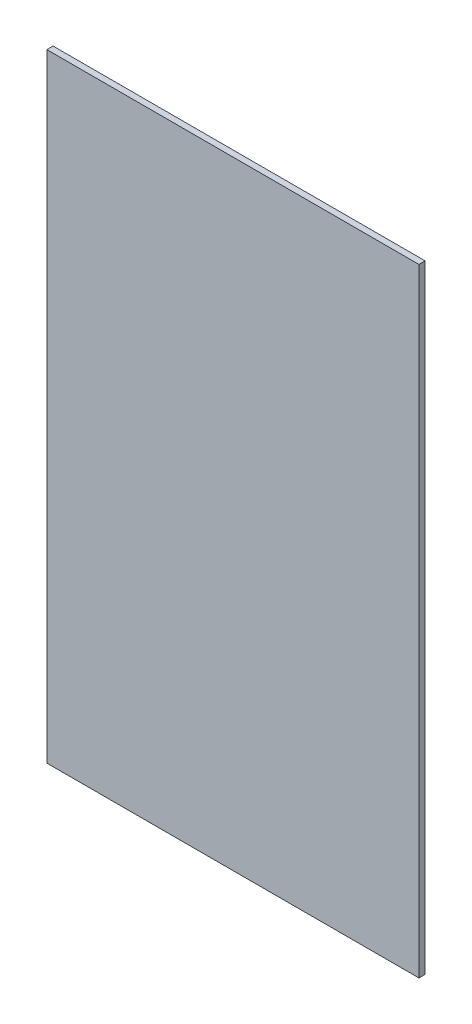
ISO-10303-21;
HEADER;
FILE_DESCRIPTION(('STEP AP214'),'2;1');
FILE_NAME('part.step','',(''),(''),'','','');
FILE_SCHEMA(('AUTOMOTIVE_DESIGN { 1 0 10303 214 1 1 1 1 }'));
ENDSEC;
DATA;
#1=APPLICATION_CONTEXT('core data for automotive mechanical design processes');
#2=APPLICATION_PROTOCOL_DEFINITION('international standard','automotive_design',2000,#1);
#3=PRODUCT_CONTEXT('',#1,'mechanical');
#4=PRODUCT('Part','Part','',(#3));
#5=PRODUCT_RELATED_PRODUCT_CATEGORY('part','',(#4));
#6=PRODUCT_DEFINITION_FORMATION('','',#4);
#7=PRODUCT_DEFINITION_CONTEXT('part definition',#1,'design');
#8=PRODUCT_DEFINITION('design','',#6,#7);
#9=PRODUCT_DEFINITION_SHAPE('','',#8);
#10=(LENGTH_UNIT() NAMED_UNIT(*) SI_UNIT(.MILLI.,.METRE.));
#11=(NAMED_UNIT(*) PLANE_ANGLE_UNIT() SI_UNIT($,.RADIAN.));
#12=(NAMED_UNIT(*) SI_UNIT($,.STERADIAN.) SOLID_ANGLE_UNIT());
#13=UNCERTAINTY_MEASURE_WITH_UNIT(LENGTH_MEASURE(1.E-05),#10,'distance_accuracy_value','');
#14=(GEOMETRIC_REPRESENTATION_CONTEXT(3) GLOBAL_UNCERTAINTY_ASSIGNED_CONTEXT((#13)) GLOBAL_UNIT_ASSIGNED_CONTEXT((#10,
#11,#12)) REPRESENTATION_CONTEXT('',''));
#15=CARTESIAN_POINT('',(0.,0.,0.));
#16=DIRECTION('',(0.,0.,1.));
#17=DIRECTION('',(1.,0.,0.));
#18=AXIS2_PLACEMENT_3D('',#15,#16,#17);
#19=CARTESIAN_POINT('',(-215.135135135135,216.860411045452,8.));
#20=DIRECTION('',(1.,0.,0.));
#21=DIRECTION('',(0.,1.,0.));
#22=AXIS2_PLACEMENT_3D('',#19,#20,#21);
#23=PLANE('',#22);
#24=DIRECTION('',(0.,-1.,0.));
#25=VECTOR('',#24,1.);
#26=CARTESIAN_POINT('',(-215.135135135135,216.860411045452,0.));
#27=LINE('',#26,#25);
#28=CARTESIAN_POINT('',(-215.135135135135,216.860411045452,0.));
#29=VERTEX_POINT('',#28);
#30=CARTESIAN_POINT('',(-215.135135135135,-580.139588954548,0.));
#31=VERTEX_POINT('',#30);
#32=EDGE_CURVE('E106',#29,#31,#27,.T.);
#33=ORIENTED_EDGE('',*,*,#32,.T.);
#34=DIRECTION('',(0.,0.,-1.));
#35=VECTOR('',#34,1.);
#36=CARTESIAN_POINT('',(-215.135135135135,-580.139588954548,8.));
#37=LINE('',#36,#35);
#38=CARTESIAN_POINT('',(-215.135135135135,-580.139588954548,8.));
#39=VERTEX_POINT('',#38);
#40=EDGE_CURVE('E11',#39,#31,#37,.T.);
#41=ORIENTED_EDGE('',*,*,#40,.F.);
#42=DIRECTION('',(0.,-1.,0.));
#43=VECTOR('',#42,1.);
#44=CARTESIAN_POINT('',(-215.135135135135,216.860411045452,8.));
#45=LINE('',#44,#43);
#46=CARTESIAN_POINT('',(-215.135135135135,216.860411045452,8.));
#47=VERTEX_POINT('',#46);
#48=EDGE_CURVE('E94',#47,#39,#45,.T.);
#49=ORIENTED_EDGE('',*,*,#48,.F.);
#50=DIRECTION('',(0.,0.,-1.));
#51=VECTOR('',#50,1.);
#52=CARTESIAN_POINT('',(-215.135135135135,216.860411045452,8.));
#53=LINE('',#52,#51);
#54=EDGE_CURVE('E102',#47,#29,#53,.T.);
#55=ORIENTED_EDGE('',*,*,#54,.T.);
#56=EDGE_LOOP('',(#33,#41,#49,#55));
#57=FACE_BOUND('',#56,.T.);
#58=ADVANCED_FACE('F43',(#57),#23,.F.);
#59=CARTESIAN_POINT('',(-215.135135135135,-580.139588954548,8.));
#60=DIRECTION('',(0.,1.,0.));
#61=DIRECTION('',(0.,0.,1.));
#62=AXIS2_PLACEMENT_3D('',#59,#60,#61);
#63=PLANE('',#62);
#64=DIRECTION('',(1.,0.,0.));
#65=VECTOR('',#64,1.);
#66=CARTESIAN_POINT('',(-215.135135135135,-580.139588954548,0.));
#67=LINE('',#66,#65);
#68=CARTESIAN_POINT('',(264.864864864865,-580.139588954548,0.));
#69=VERTEX_POINT('',#68);
#70=EDGE_CURVE('E98',#31,#69,#67,.T.);
#71=ORIENTED_EDGE('',*,*,#70,.T.);
#72=DIRECTION('',(0.,0.,-1.));
#73=VECTOR('',#72,1.);
#74=CARTESIAN_POINT('',(264.864864864865,-580.139588954548,8.));
#75=LINE('',#74,#73);
#76=CARTESIAN_POINT('',(264.864864864865,-580.139588954548,8.));
#77=VERTEX_POINT('',#76);
#78=EDGE_CURVE('E51',#77,#69,#75,.T.);
#79=ORIENTED_EDGE('',*,*,#78,.F.);
#80=DIRECTION('',(1.,0.,0.));
#81=VECTOR('',#80,1.);
#82=CARTESIAN_POINT('',(-215.135135135135,-580.139588954548,8.));
#83=LINE('',#82,#81);
#84=EDGE_CURVE('E89',#39,#77,#83,.T.);
#85=ORIENTED_EDGE('',*,*,#84,.F.);
#86=ORIENTED_EDGE('',*,*,#40,.T.);
#87=EDGE_LOOP('',(#71,#79,#85,#86));
#88=FACE_BOUND('',#87,.T.);
#89=ADVANCED_FACE('F97',(#88),#63,.F.);
#90=CARTESIAN_POINT('',(264.864864864865,216.860411045452,8.));
#91=DIRECTION('',(-1.,0.,0.));
#92=DIRECTION('',(0.,-1.,0.));
#93=AXIS2_PLACEMENT_3D('',#90,#91,#92);
#94=PLANE('',#93);
#95=DIRECTION('',(0.,1.,0.));
#96=VECTOR('',#95,1.);
#97=CARTESIAN_POINT('',(264.864864864865,216.860411045452,0.));
#98=LINE('',#97,#96);
#99=CARTESIAN_POINT('',(264.864864864865,216.860411045452,0.));
#100=VERTEX_POINT('',#99);
#101=EDGE_CURVE('E76',#69,#100,#98,.T.);
#102=ORIENTED_EDGE('',*,*,#101,.T.);
#103=DIRECTION('',(0.,0.,-1.));
#104=VECTOR('',#103,1.);
#105=CARTESIAN_POINT('',(264.864864864865,216.860411045452,8.));
#106=LINE('',#105,#104);
#107=CARTESIAN_POINT('',(264.864864864865,216.860411045452,8.));
#108=VERTEX_POINT('',#107);
#109=EDGE_CURVE('E99',#108,#100,#106,.T.);
#110=ORIENTED_EDGE('',*,*,#109,.F.);
#111=DIRECTION('',(0.,1.,0.));
#112=VECTOR('',#111,1.);
#113=CARTESIAN_POINT('',(264.864864864865,216.860411045452,8.));
#114=LINE('',#113,#112);
#115=EDGE_CURVE('E92',#77,#108,#114,.T.);
#116=ORIENTED_EDGE('',*,*,#115,.F.);
#117=ORIENTED_EDGE('',*,*,#78,.T.);
#118=EDGE_LOOP('',(#102,#110,#116,#117));
#119=FACE_BOUND('',#118,.T.);
#120=ADVANCED_FACE('F100',(#119),#94,.F.);
#121=CARTESIAN_POINT('',(-215.135135135135,216.860411045452,8.));
#122=DIRECTION('',(0.,-1.,0.));
#123=DIRECTION('',(0.,0.,-1.));
#124=AXIS2_PLACEMENT_3D('',#121,#122,#123);
#125=PLANE('',#124);
#126=DIRECTION('',(-1.,0.,0.));
#127=VECTOR('',#126,1.);
#128=CARTESIAN_POINT('',(-215.135135135135,216.860411045452,0.));
#129=LINE('',#128,#127);
#130=EDGE_CURVE('E82',#100,#29,#129,.T.);
#131=ORIENTED_EDGE('',*,*,#130,.T.);
#132=ORIENTED_EDGE('',*,*,#54,.F.);
#133=DIRECTION('',(-1.,0.,0.));
#134=VECTOR('',#133,1.);
#135=CARTESIAN_POINT('',(-215.135135135135,216.860411045452,8.));
#136=LINE('',#135,#134);
#137=EDGE_CURVE('E59',#108,#47,#136,.T.);
#138=ORIENTED_EDGE('',*,*,#137,.F.);
#139=ORIENTED_EDGE('',*,*,#109,.T.);
#140=EDGE_LOOP('',(#131,#132,#138,#139));
#141=FACE_BOUND('',#140,.T.);
#142=ADVANCED_FACE('F113',(#141),#125,.F.);
#143=CARTESIAN_POINT('',(0.,0.,8.));
#144=DIRECTION('',(0.,0.,1.));
#145=DIRECTION('',(1.,0.,0.));
#146=AXIS2_PLACEMENT_3D('',#143,#144,#145);
#147=PLANE('',#146);
#148=ORIENTED_EDGE('',*,*,#48,.T.);
#149=ORIENTED_EDGE('',*,*,#84,.T.);
#150=ORIENTED_EDGE('',*,*,#115,.T.);
#151=ORIENTED_EDGE('',*,*,#137,.T.);
#152=EDGE_LOOP('',(#148,#149,#150,#151));
#153=FACE_BOUND('',#152,.T.);
#154=ADVANCED_FACE('F90',(#153),#147,.T.);
#155=CARTESIAN_POINT('',(0.,0.,0.));
#156=DIRECTION('',(0.,0.,1.));
#157=DIRECTION('',(1.,0.,0.));
#158=AXIS2_PLACEMENT_3D('',#155,#156,#157);
#159=PLANE('',#158);
#160=ORIENTED_EDGE('',*,*,#32,.F.);
#161=ORIENTED_EDGE('',*,*,#130,.F.);
#162=ORIENTED_EDGE('',*,*,#101,.F.);
#163=ORIENTED_EDGE('',*,*,#70,.F.);
#164=EDGE_LOOP('',(#160,#161,#162,#163));
#165=FACE_BOUND('',#164,.T.);
#166=ADVANCED_FACE('F116',(#165),#159,.F.);
#167=CLOSED_SHELL('',(#58,#89,#120,#142,#154,#166));
#168=MANIFOLD_SOLID_BREP('B2',#167);
#169=ADVANCED_BREP_SHAPE_REPRESENTATION('',(#18,#168),#14);
#170=SHAPE_DEFINITION_REPRESENTATION(#9,#169);
ENDSEC;
END-ISO-10303-21;
